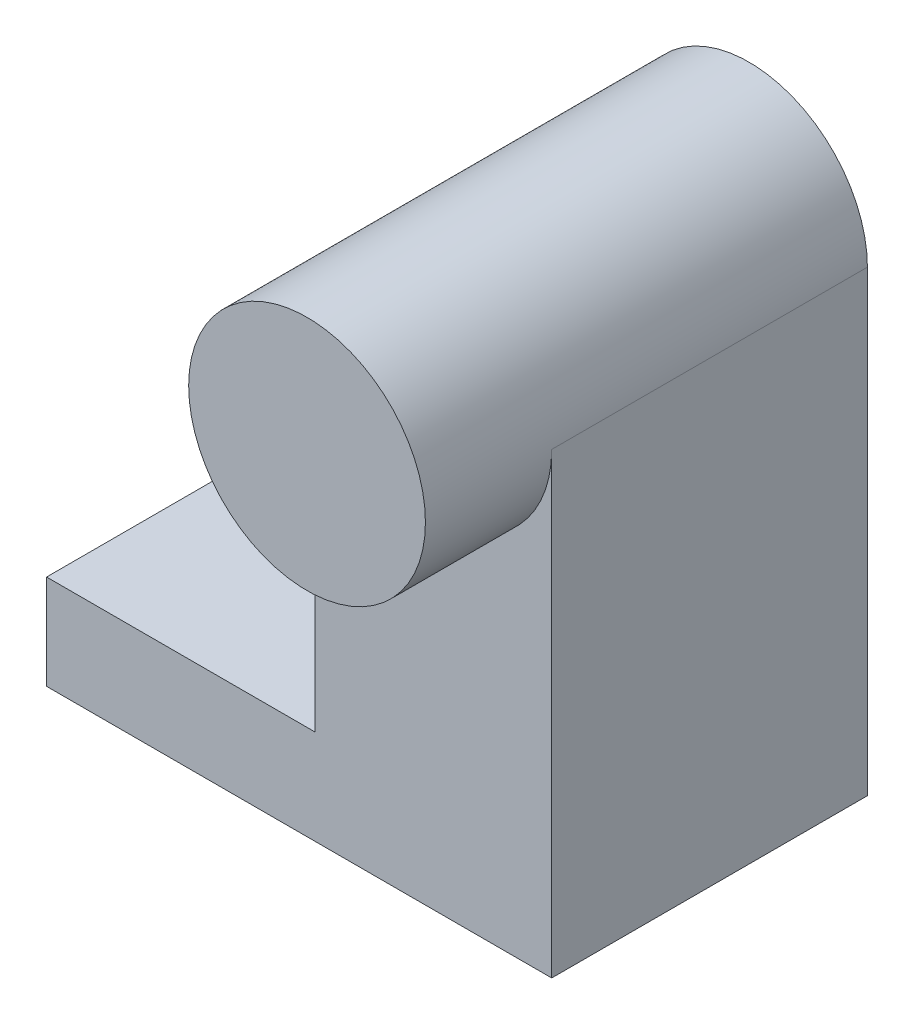
ISO-10303-21;
HEADER;
FILE_DESCRIPTION(('STEP AP214'),'2;1');
FILE_NAME('part.step','',(''),(''),'','','');
FILE_SCHEMA(('AUTOMOTIVE_DESIGN { 1 0 10303 214 1 1 1 1 }'));
ENDSEC;
DATA;
#1=APPLICATION_CONTEXT('core data for automotive mechanical design processes');
#2=APPLICATION_PROTOCOL_DEFINITION('international standard','automotive_design',2000,#1);
#3=PRODUCT_CONTEXT('',#1,'mechanical');
#4=PRODUCT('Part','Part','',(#3));
#5=PRODUCT_RELATED_PRODUCT_CATEGORY('part','',(#4));
#6=PRODUCT_DEFINITION_FORMATION('','',#4);
#7=PRODUCT_DEFINITION_CONTEXT('part definition',#1,'design');
#8=PRODUCT_DEFINITION('design','',#6,#7);
#9=PRODUCT_DEFINITION_SHAPE('','',#8);
#10=(LENGTH_UNIT() NAMED_UNIT(*) SI_UNIT(.MILLI.,.METRE.));
#11=(NAMED_UNIT(*) PLANE_ANGLE_UNIT() SI_UNIT($,.RADIAN.));
#12=(NAMED_UNIT(*) SI_UNIT($,.STERADIAN.) SOLID_ANGLE_UNIT());
#13=UNCERTAINTY_MEASURE_WITH_UNIT(LENGTH_MEASURE(1.E-05),#10,'distance_accuracy_value','');
#14=(GEOMETRIC_REPRESENTATION_CONTEXT(3) GLOBAL_UNCERTAINTY_ASSIGNED_CONTEXT((#13)) GLOBAL_UNIT_ASSIGNED_CONTEXT((#10,
#11,#12)) REPRESENTATION_CONTEXT('',''));
#15=CARTESIAN_POINT('',(0.,0.,0.));
#16=DIRECTION('',(0.,0.,1.));
#17=DIRECTION('',(1.,0.,0.));
#18=AXIS2_PLACEMENT_3D('',#15,#16,#17);
#19=CARTESIAN_POINT('',(0.,0.,20.));
#20=DIRECTION('',(0.,0.,-1.));
#21=DIRECTION('',(-1.,0.,0.));
#22=AXIS2_PLACEMENT_3D('',#19,#20,#21);
#23=CYLINDRICAL_SURFACE('',#22,7.5);
#24=CARTESIAN_POINT('',(0.,0.,0.));
#25=DIRECTION('',(0.,0.,1.));
#26=DIRECTION('',(1.,0.,0.));
#27=AXIS2_PLACEMENT_3D('',#24,#25,#26);
#28=CIRCLE('',#27,7.5);
#29=CARTESIAN_POINT('',(7.5,0.,0.));
#30=VERTEX_POINT('',#29);
#31=CARTESIAN_POINT('',(-7.5,0.,0.));
#32=VERTEX_POINT('',#31);
#33=EDGE_CURVE('E120',#30,#32,#28,.T.);
#34=ORIENTED_EDGE('',*,*,#33,.T.);
#35=DIRECTION('',(0.,0.,-1.));
#36=VECTOR('',#35,1.);
#37=CARTESIAN_POINT('',(-7.5,0.,20.));
#38=LINE('',#37,#36);
#39=CARTESIAN_POINT('',(-7.5,0.,20.));
#40=VERTEX_POINT('',#39);
#41=EDGE_CURVE('E36',#40,#32,#38,.T.);
#42=ORIENTED_EDGE('',*,*,#41,.F.);
#43=CARTESIAN_POINT('',(0.,0.,20.));
#44=DIRECTION('',(0.,0.,1.));
#45=DIRECTION('',(1.,0.,0.));
#46=AXIS2_PLACEMENT_3D('',#43,#44,#45);
#47=CIRCLE('',#46,7.5);
#48=CARTESIAN_POINT('',(7.5,0.,20.));
#49=VERTEX_POINT('',#48);
#50=EDGE_CURVE('E11',#40,#49,#47,.T.);
#51=ORIENTED_EDGE('',*,*,#50,.T.);
#52=DIRECTION('',(0.,0.,-1.));
#53=VECTOR('',#52,1.);
#54=CARTESIAN_POINT('',(7.5,0.,20.));
#55=LINE('',#54,#53);
#56=EDGE_CURVE('E119',#49,#30,#55,.T.);
#57=ORIENTED_EDGE('',*,*,#56,.T.);
#58=EDGE_LOOP('',(#34,#42,#51,#57));
#59=FACE_BOUND('',#58,.T.);
#60=CARTESIAN_POINT('',(0.,0.,28.));
#61=DIRECTION('',(0.,0.,1.));
#62=DIRECTION('',(1.,0.,0.));
#63=AXIS2_PLACEMENT_3D('',#60,#61,#62);
#64=CIRCLE('',#63,7.5);
#65=CARTESIAN_POINT('',(7.5,0.,28.));
#66=VERTEX_POINT('',#65);
#67=EDGE_CURVE('E124',#66,#66,#64,.T.);
#68=ORIENTED_EDGE('',*,*,#67,.F.);
#69=EDGE_LOOP('',(#68));
#70=FACE_BOUND('',#69,.T.);
#71=ADVANCED_FACE('F33',(#59,#70),#23,.T.);
#72=CARTESIAN_POINT('',(-7.5,-23.,20.));
#73=DIRECTION('',(1.,0.,0.));
#74=DIRECTION('',(0.,1.,0.));
#75=AXIS2_PLACEMENT_3D('',#72,#73,#74);
#76=PLANE('',#75);
#77=DIRECTION('',(0.,-1.,0.));
#78=VECTOR('',#77,1.);
#79=CARTESIAN_POINT('',(-7.5,-23.,0.));
#80=LINE('',#79,#78);
#81=CARTESIAN_POINT('',(-7.5,-23.,0.));
#82=VERTEX_POINT('',#81);
#83=EDGE_CURVE('E123',#32,#82,#80,.T.);
#84=ORIENTED_EDGE('',*,*,#83,.T.);
#85=DIRECTION('',(0.,0.,-1.));
#86=VECTOR('',#85,1.);
#87=CARTESIAN_POINT('',(-7.5,-23.,20.));
#88=LINE('',#87,#86);
#89=CARTESIAN_POINT('',(-7.5,-23.,20.));
#90=VERTEX_POINT('',#89);
#91=EDGE_CURVE('E109',#90,#82,#88,.T.);
#92=ORIENTED_EDGE('',*,*,#91,.F.);
#93=DIRECTION('',(0.,-1.,0.));
#94=VECTOR('',#93,1.);
#95=CARTESIAN_POINT('',(-7.5,-23.,20.));
#96=LINE('',#95,#94);
#97=EDGE_CURVE('E97',#40,#90,#96,.T.);
#98=ORIENTED_EDGE('',*,*,#97,.F.);
#99=ORIENTED_EDGE('',*,*,#41,.T.);
#100=EDGE_LOOP('',(#84,#92,#98,#99));
#101=FACE_BOUND('',#100,.T.);
#102=ADVANCED_FACE('F137',(#101),#76,.F.);
#103=CARTESIAN_POINT('',(-24.5,-23.,20.));
#104=DIRECTION('',(0.,-1.,0.));
#105=DIRECTION('',(0.,0.,-1.));
#106=AXIS2_PLACEMENT_3D('',#103,#104,#105);
#107=PLANE('',#106);
#108=DIRECTION('',(-1.,0.,0.));
#109=VECTOR('',#108,1.);
#110=CARTESIAN_POINT('',(-24.5,-23.,0.));
#111=LINE('',#110,#109);
#112=CARTESIAN_POINT('',(-24.5,-23.,0.));
#113=VERTEX_POINT('',#112);
#114=EDGE_CURVE('E106',#82,#113,#111,.T.);
#115=ORIENTED_EDGE('',*,*,#114,.T.);
#116=DIRECTION('',(0.,0.,-1.));
#117=VECTOR('',#116,1.);
#118=CARTESIAN_POINT('',(-24.5,-23.,20.));
#119=LINE('',#118,#117);
#120=CARTESIAN_POINT('',(-24.5,-23.,20.));
#121=VERTEX_POINT('',#120);
#122=EDGE_CURVE('E103',#121,#113,#119,.T.);
#123=ORIENTED_EDGE('',*,*,#122,.F.);
#124=DIRECTION('',(-1.,0.,0.));
#125=VECTOR('',#124,1.);
#126=CARTESIAN_POINT('',(-24.5,-23.,20.));
#127=LINE('',#126,#125);
#128=EDGE_CURVE('E91',#90,#121,#127,.T.);
#129=ORIENTED_EDGE('',*,*,#128,.F.);
#130=ORIENTED_EDGE('',*,*,#91,.T.);
#131=EDGE_LOOP('',(#115,#123,#129,#130));
#132=FACE_BOUND('',#131,.T.);
#133=ADVANCED_FACE('F104',(#132),#107,.F.);
#134=CARTESIAN_POINT('',(-24.5,-29.,20.));
#135=DIRECTION('',(1.,0.,0.));
#136=DIRECTION('',(0.,1.,0.));
#137=AXIS2_PLACEMENT_3D('',#134,#135,#136);
#138=PLANE('',#137);
#139=DIRECTION('',(0.,-1.,0.));
#140=VECTOR('',#139,1.);
#141=CARTESIAN_POINT('',(-24.5,-29.,0.));
#142=LINE('',#141,#140);
#143=CARTESIAN_POINT('',(-24.5,-29.,0.));
#144=VERTEX_POINT('',#143);
#145=EDGE_CURVE('E127',#113,#144,#142,.T.);
#146=ORIENTED_EDGE('',*,*,#145,.T.);
#147=DIRECTION('',(0.,0.,-1.));
#148=VECTOR('',#147,1.);
#149=CARTESIAN_POINT('',(-24.5,-29.,20.));
#150=LINE('',#149,#148);
#151=CARTESIAN_POINT('',(-24.5,-29.,20.));
#152=VERTEX_POINT('',#151);
#153=EDGE_CURVE('E110',#152,#144,#150,.T.);
#154=ORIENTED_EDGE('',*,*,#153,.F.);
#155=DIRECTION('',(0.,-1.,0.));
#156=VECTOR('',#155,1.);
#157=CARTESIAN_POINT('',(-24.5,-29.,20.));
#158=LINE('',#157,#156);
#159=EDGE_CURVE('E95',#121,#152,#158,.T.);
#160=ORIENTED_EDGE('',*,*,#159,.F.);
#161=ORIENTED_EDGE('',*,*,#122,.T.);
#162=EDGE_LOOP('',(#146,#154,#160,#161));
#163=FACE_BOUND('',#162,.T.);
#164=ADVANCED_FACE('F112',(#163),#138,.F.);
#165=CARTESIAN_POINT('',(7.5,-29.,20.));
#166=DIRECTION('',(0.,1.,0.));
#167=DIRECTION('',(0.,0.,1.));
#168=AXIS2_PLACEMENT_3D('',#165,#166,#167);
#169=PLANE('',#168);
#170=DIRECTION('',(1.,0.,0.));
#171=VECTOR('',#170,1.);
#172=CARTESIAN_POINT('',(7.5,-29.,0.));
#173=LINE('',#172,#171);
#174=CARTESIAN_POINT('',(7.5,-29.,0.));
#175=VERTEX_POINT('',#174);
#176=EDGE_CURVE('E73',#144,#175,#173,.T.);
#177=ORIENTED_EDGE('',*,*,#176,.T.);
#178=DIRECTION('',(0.,0.,-1.));
#179=VECTOR('',#178,1.);
#180=CARTESIAN_POINT('',(7.5,-29.,20.));
#181=LINE('',#180,#179);
#182=CARTESIAN_POINT('',(7.5,-29.,20.));
#183=VERTEX_POINT('',#182);
#184=EDGE_CURVE('E132',#183,#175,#181,.T.);
#185=ORIENTED_EDGE('',*,*,#184,.F.);
#186=DIRECTION('',(1.,0.,0.));
#187=VECTOR('',#186,1.);
#188=CARTESIAN_POINT('',(7.5,-29.,20.));
#189=LINE('',#188,#187);
#190=EDGE_CURVE('E50',#152,#183,#189,.T.);
#191=ORIENTED_EDGE('',*,*,#190,.F.);
#192=ORIENTED_EDGE('',*,*,#153,.T.);
#193=EDGE_LOOP('',(#177,#185,#191,#192));
#194=FACE_BOUND('',#193,.T.);
#195=ADVANCED_FACE('F143',(#194),#169,.F.);
#196=CARTESIAN_POINT('',(7.5,0.,20.));
#197=DIRECTION('',(-1.,0.,0.));
#198=DIRECTION('',(0.,0.,1.));
#199=AXIS2_PLACEMENT_3D('',#196,#197,#198);
#200=PLANE('',#199);
#201=DIRECTION('',(0.,1.,0.));
#202=VECTOR('',#201,1.);
#203=CARTESIAN_POINT('',(7.5,0.,0.));
#204=LINE('',#203,#202);
#205=EDGE_CURVE('E80',#175,#30,#204,.T.);
#206=ORIENTED_EDGE('',*,*,#205,.T.);
#207=ORIENTED_EDGE('',*,*,#56,.F.);
#208=DIRECTION('',(0.,1.,0.));
#209=VECTOR('',#208,1.);
#210=CARTESIAN_POINT('',(7.5,0.,20.));
#211=LINE('',#210,#209);
#212=EDGE_CURVE('E114',#183,#49,#211,.T.);
#213=ORIENTED_EDGE('',*,*,#212,.F.);
#214=ORIENTED_EDGE('',*,*,#184,.T.);
#215=EDGE_LOOP('',(#206,#207,#213,#214));
#216=FACE_BOUND('',#215,.T.);
#217=ADVANCED_FACE('F145',(#216),#200,.F.);
#218=CARTESIAN_POINT('',(0.,0.,20.));
#219=DIRECTION('',(0.,0.,1.));
#220=DIRECTION('',(1.,0.,0.));
#221=AXIS2_PLACEMENT_3D('',#218,#219,#220);
#222=PLANE('',#221);
#223=ORIENTED_EDGE('',*,*,#50,.F.);
#224=ORIENTED_EDGE('',*,*,#97,.T.);
#225=ORIENTED_EDGE('',*,*,#128,.T.);
#226=ORIENTED_EDGE('',*,*,#159,.T.);
#227=ORIENTED_EDGE('',*,*,#190,.T.);
#228=ORIENTED_EDGE('',*,*,#212,.T.);
#229=EDGE_LOOP('',(#223,#224,#225,#226,#227,#228));
#230=FACE_BOUND('',#229,.T.);
#231=ADVANCED_FACE('F93',(#230),#222,.T.);
#232=CARTESIAN_POINT('',(0.,0.,0.));
#233=DIRECTION('',(0.,0.,1.));
#234=DIRECTION('',(1.,0.,0.));
#235=AXIS2_PLACEMENT_3D('',#232,#233,#234);
#236=PLANE('',#235);
#237=ORIENTED_EDGE('',*,*,#33,.F.);
#238=ORIENTED_EDGE('',*,*,#205,.F.);
#239=ORIENTED_EDGE('',*,*,#176,.F.);
#240=ORIENTED_EDGE('',*,*,#145,.F.);
#241=ORIENTED_EDGE('',*,*,#114,.F.);
#242=ORIENTED_EDGE('',*,*,#83,.F.);
#243=EDGE_LOOP('',(#237,#238,#239,#240,#241,#242));
#244=FACE_BOUND('',#243,.T.);
#245=ADVANCED_FACE('F142',(#244),#236,.F.);
#246=CARTESIAN_POINT('',(0.,0.,28.));
#247=DIRECTION('',(0.,0.,1.));
#248=DIRECTION('',(1.,0.,0.));
#249=AXIS2_PLACEMENT_3D('',#246,#247,#248);
#250=PLANE('',#249);
#251=ORIENTED_EDGE('',*,*,#67,.T.);
#252=EDGE_LOOP('',(#251));
#253=FACE_BOUND('',#252,.T.);
#254=ADVANCED_FACE('F186',(#253),#250,.T.);
#255=CLOSED_SHELL('',(#71,#102,#133,#164,#195,#217,#231,#245,#254));
#256=MANIFOLD_SOLID_BREP('B2',#255);
#257=ADVANCED_BREP_SHAPE_REPRESENTATION('',(#18,#256),#14);
#258=SHAPE_DEFINITION_REPRESENTATION(#9,#257);
ENDSEC;
END-ISO-10303-21;
